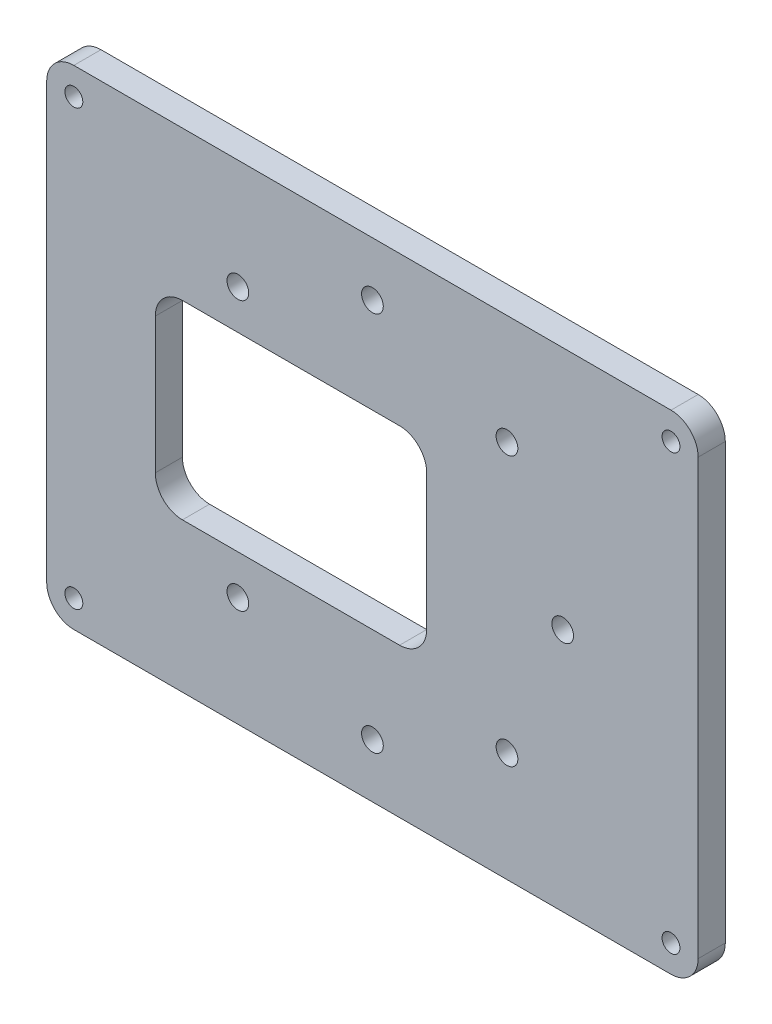
ISO-10303-21;
HEADER;
FILE_DESCRIPTION(('STEP AP214'),'2;1');
FILE_NAME('part.step','',(''),(''),'','','');
FILE_SCHEMA(('AUTOMOTIVE_DESIGN { 1 0 10303 214 1 1 1 1 }'));
ENDSEC;
DATA;
#1=APPLICATION_CONTEXT('core data for automotive mechanical design processes');
#2=APPLICATION_PROTOCOL_DEFINITION('international standard','automotive_design',2000,#1);
#3=PRODUCT_CONTEXT('',#1,'mechanical');
#4=PRODUCT('Part','Part','',(#3));
#5=PRODUCT_RELATED_PRODUCT_CATEGORY('part','',(#4));
#6=PRODUCT_DEFINITION_FORMATION('','',#4);
#7=PRODUCT_DEFINITION_CONTEXT('part definition',#1,'design');
#8=PRODUCT_DEFINITION('design','',#6,#7);
#9=PRODUCT_DEFINITION_SHAPE('','',#8);
#10=(LENGTH_UNIT() NAMED_UNIT(*) SI_UNIT(.MILLI.,.METRE.));
#11=(NAMED_UNIT(*) PLANE_ANGLE_UNIT() SI_UNIT($,.RADIAN.));
#12=(NAMED_UNIT(*) SI_UNIT($,.STERADIAN.) SOLID_ANGLE_UNIT());
#13=UNCERTAINTY_MEASURE_WITH_UNIT(LENGTH_MEASURE(1.E-05),#10,'distance_accuracy_value','');
#14=(GEOMETRIC_REPRESENTATION_CONTEXT(3) GLOBAL_UNCERTAINTY_ASSIGNED_CONTEXT((#13)) GLOBAL_UNIT_ASSIGNED_CONTEXT((#10,
#11,#12)) REPRESENTATION_CONTEXT('',''));
#15=CARTESIAN_POINT('',(0.,0.,0.));
#16=DIRECTION('',(0.,0.,1.));
#17=DIRECTION('',(1.,0.,0.));
#18=AXIS2_PLACEMENT_3D('',#15,#16,#17);
#19=CARTESIAN_POINT('',(0.,0.,5.));
#20=DIRECTION('',(0.,0.,-1.));
#21=DIRECTION('',(-1.,0.,0.));
#22=AXIS2_PLACEMENT_3D('',#19,#20,#21);
#23=PLANE('',#22);
#24=CARTESIAN_POINT('',(-24.95,-45.,5.));
#25=DIRECTION('',(0.,0.,1.));
#26=DIRECTION('',(1.,0.,0.));
#27=AXIS2_PLACEMENT_3D('',#24,#25,#26);
#28=CIRCLE('',#27,2.);
#29=CARTESIAN_POINT('',(-22.95,-45.,5.));
#30=VERTEX_POINT('',#29);
#31=EDGE_CURVE('E318',#30,#30,#28,.T.);
#32=ORIENTED_EDGE('',*,*,#31,.F.);
#33=EDGE_LOOP('',(#32));
#34=FACE_BOUND('',#33,.T.);
#35=CARTESIAN_POINT('',(-115.,-5.,5.));
#36=DIRECTION('',(0.,0.,1.));
#37=DIRECTION('',(1.,0.,0.));
#38=AXIS2_PLACEMENT_3D('',#35,#36,#37);
#39=CIRCLE('',#38,1.65);
#40=CARTESIAN_POINT('',(-113.35,-5.,5.));
#41=VERTEX_POINT('',#40);
#42=EDGE_CURVE('E338',#41,#41,#39,.T.);
#43=ORIENTED_EDGE('',*,*,#42,.F.);
#44=EDGE_LOOP('',(#43));
#45=FACE_BOUND('',#44,.T.);
#46=CARTESIAN_POINT('',(-4.99999999999999,-5.,5.));
#47=DIRECTION('',(0.,0.,1.));
#48=DIRECTION('',(1.,0.,0.));
#49=AXIS2_PLACEMENT_3D('',#46,#47,#48);
#50=CIRCLE('',#49,1.65);
#51=CARTESIAN_POINT('',(-3.34999999999999,-5.,5.));
#52=VERTEX_POINT('',#51);
#53=EDGE_CURVE('E346',#52,#52,#50,.T.);
#54=ORIENTED_EDGE('',*,*,#53,.F.);
#55=EDGE_LOOP('',(#54));
#56=FACE_BOUND('',#55,.T.);
#57=CARTESIAN_POINT('',(-4.99999999999998,-85.,5.));
#58=DIRECTION('',(0.,0.,1.));
#59=DIRECTION('',(1.,0.,0.));
#60=AXIS2_PLACEMENT_3D('',#57,#58,#59);
#61=CIRCLE('',#60,1.65);
#62=CARTESIAN_POINT('',(-3.34999999999998,-85.,5.));
#63=VERTEX_POINT('',#62);
#64=EDGE_CURVE('E354',#63,#63,#61,.T.);
#65=ORIENTED_EDGE('',*,*,#64,.F.);
#66=EDGE_LOOP('',(#65));
#67=FACE_BOUND('',#66,.T.);
#68=CARTESIAN_POINT('',(-115.,-85.,5.));
#69=DIRECTION('',(0.,0.,1.));
#70=DIRECTION('',(1.,0.,0.));
#71=AXIS2_PLACEMENT_3D('',#68,#69,#70);
#72=CIRCLE('',#71,1.65);
#73=CARTESIAN_POINT('',(-113.35,-85.,5.));
#74=VERTEX_POINT('',#73);
#75=EDGE_CURVE('E184',#74,#74,#72,.T.);
#76=ORIENTED_EDGE('',*,*,#75,.F.);
#77=EDGE_LOOP('',(#76));
#78=FACE_BOUND('',#77,.T.);
#79=DIRECTION('',(1.,0.,0.));
#80=VECTOR('',#79,1.);
#81=CARTESIAN_POINT('',(0.,-90.,5.));
#82=LINE('',#81,#80);
#83=CARTESIAN_POINT('',(-115.,-90.,5.));
#84=VERTEX_POINT('',#83);
#85=CARTESIAN_POINT('',(-4.99999999999999,-90.,5.));
#86=VERTEX_POINT('',#85);
#87=EDGE_CURVE('E195',#84,#86,#82,.T.);
#88=ORIENTED_EDGE('',*,*,#87,.T.);
#89=CARTESIAN_POINT('',(-4.99999999999999,-85.,5.));
#90=DIRECTION('',(0.,0.,-1.));
#91=DIRECTION('',(-1.,0.,0.));
#92=AXIS2_PLACEMENT_3D('',#89,#90,#91);
#93=CIRCLE('',#92,5.);
#94=CARTESIAN_POINT('',(0.,-85.,5.));
#95=VERTEX_POINT('',#94);
#96=EDGE_CURVE('E227',#86,#95,#93,.F.);
#97=ORIENTED_EDGE('',*,*,#96,.T.);
#98=DIRECTION('',(0.,1.,0.));
#99=VECTOR('',#98,1.);
#100=CARTESIAN_POINT('',(0.,0.,5.));
#101=LINE('',#100,#99);
#102=CARTESIAN_POINT('',(0.,-5.,5.));
#103=VERTEX_POINT('',#102);
#104=EDGE_CURVE('E174',#95,#103,#101,.T.);
#105=ORIENTED_EDGE('',*,*,#104,.T.);
#106=CARTESIAN_POINT('',(-5.,-5.,5.));
#107=DIRECTION('',(0.,0.,-1.));
#108=DIRECTION('',(-1.,0.,0.));
#109=AXIS2_PLACEMENT_3D('',#106,#107,#108);
#110=CIRCLE('',#109,5.);
#111=CARTESIAN_POINT('',(-5.,0.,5.));
#112=VERTEX_POINT('',#111);
#113=EDGE_CURVE('E218',#103,#112,#110,.F.);
#114=ORIENTED_EDGE('',*,*,#113,.T.);
#115=DIRECTION('',(-1.,0.,0.));
#116=VECTOR('',#115,1.);
#117=CARTESIAN_POINT('',(0.,0.,5.));
#118=LINE('',#117,#116);
#119=CARTESIAN_POINT('',(-115.,0.,5.));
#120=VERTEX_POINT('',#119);
#121=EDGE_CURVE('E366',#112,#120,#118,.T.);
#122=ORIENTED_EDGE('',*,*,#121,.T.);
#123=CARTESIAN_POINT('',(-115.,-5.,5.));
#124=DIRECTION('',(0.,0.,-1.));
#125=DIRECTION('',(-1.,0.,0.));
#126=AXIS2_PLACEMENT_3D('',#123,#124,#125);
#127=CIRCLE('',#126,5.);
#128=CARTESIAN_POINT('',(-120.,-5.,5.));
#129=VERTEX_POINT('',#128);
#130=EDGE_CURVE('E221',#120,#129,#127,.F.);
#131=ORIENTED_EDGE('',*,*,#130,.T.);
#132=DIRECTION('',(0.,-1.,0.));
#133=VECTOR('',#132,1.);
#134=CARTESIAN_POINT('',(-120.,0.,5.));
#135=LINE('',#134,#133);
#136=CARTESIAN_POINT('',(-120.,-85.,5.));
#137=VERTEX_POINT('',#136);
#138=EDGE_CURVE('E369',#129,#137,#135,.T.);
#139=ORIENTED_EDGE('',*,*,#138,.T.);
#140=CARTESIAN_POINT('',(-115.,-85.,5.));
#141=DIRECTION('',(0.,0.,-1.));
#142=DIRECTION('',(-1.,0.,0.));
#143=AXIS2_PLACEMENT_3D('',#140,#141,#142);
#144=CIRCLE('',#143,5.);
#145=EDGE_CURVE('E224',#137,#84,#144,.F.);
#146=ORIENTED_EDGE('',*,*,#145,.T.);
#147=EDGE_LOOP('',(#88,#97,#105,#114,#122,#131,#139,#146));
#148=FACE_BOUND('',#147,.T.);
#149=DIRECTION('',(0.,-1.,0.));
#150=VECTOR('',#149,1.);
#151=CARTESIAN_POINT('',(-100.,-27.5,5.));
#152=LINE('',#151,#150);
#153=CARTESIAN_POINT('',(-100.,-32.5,5.));
#154=VERTEX_POINT('',#153);
#155=CARTESIAN_POINT('',(-100.,-57.5,5.));
#156=VERTEX_POINT('',#155);
#157=EDGE_CURVE('E333',#154,#156,#152,.T.);
#158=ORIENTED_EDGE('',*,*,#157,.F.);
#159=CARTESIAN_POINT('',(-95.,-32.5,5.));
#160=DIRECTION('',(0.,0.,-1.));
#161=DIRECTION('',(-1.,0.,0.));
#162=AXIS2_PLACEMENT_3D('',#159,#160,#161);
#163=CIRCLE('',#162,5.);
#164=CARTESIAN_POINT('',(-95.,-27.5,5.));
#165=VERTEX_POINT('',#164);
#166=EDGE_CURVE('E11',#154,#165,#163,.T.);
#167=ORIENTED_EDGE('',*,*,#166,.T.);
#168=DIRECTION('',(-1.,0.,0.));
#169=VECTOR('',#168,1.);
#170=CARTESIAN_POINT('',(-100.,-27.5,5.));
#171=LINE('',#170,#169);
#172=CARTESIAN_POINT('',(-55.,-27.5,5.));
#173=VERTEX_POINT('',#172);
#174=EDGE_CURVE('E309',#173,#165,#171,.T.);
#175=ORIENTED_EDGE('',*,*,#174,.F.);
#176=CARTESIAN_POINT('',(-55.,-32.5,5.));
#177=DIRECTION('',(0.,0.,-1.));
#178=DIRECTION('',(-1.,0.,0.));
#179=AXIS2_PLACEMENT_3D('',#176,#177,#178);
#180=CIRCLE('',#179,5.);
#181=CARTESIAN_POINT('',(-50.,-32.5,5.));
#182=VERTEX_POINT('',#181);
#183=EDGE_CURVE('E286',#173,#182,#180,.T.);
#184=ORIENTED_EDGE('',*,*,#183,.T.);
#185=DIRECTION('',(0.,1.,0.));
#186=VECTOR('',#185,1.);
#187=CARTESIAN_POINT('',(-50.,-27.5,5.));
#188=LINE('',#187,#186);
#189=CARTESIAN_POINT('',(-50.,-57.5,5.));
#190=VERTEX_POINT('',#189);
#191=EDGE_CURVE('E313',#190,#182,#188,.T.);
#192=ORIENTED_EDGE('',*,*,#191,.F.);
#193=CARTESIAN_POINT('',(-55.,-57.5,5.));
#194=DIRECTION('',(0.,0.,-1.));
#195=DIRECTION('',(-1.,0.,0.));
#196=AXIS2_PLACEMENT_3D('',#193,#194,#195);
#197=CIRCLE('',#196,5.);
#198=CARTESIAN_POINT('',(-55.,-62.5,5.));
#199=VERTEX_POINT('',#198);
#200=EDGE_CURVE('E280',#190,#199,#197,.T.);
#201=ORIENTED_EDGE('',*,*,#200,.T.);
#202=DIRECTION('',(1.,0.,0.));
#203=VECTOR('',#202,1.);
#204=CARTESIAN_POINT('',(-100.,-62.5,5.));
#205=LINE('',#204,#203);
#206=CARTESIAN_POINT('',(-95.,-62.5,5.));
#207=VERTEX_POINT('',#206);
#208=EDGE_CURVE('E321',#207,#199,#205,.T.);
#209=ORIENTED_EDGE('',*,*,#208,.F.);
#210=CARTESIAN_POINT('',(-95.,-57.5,5.));
#211=DIRECTION('',(0.,0.,-1.));
#212=DIRECTION('',(-1.,0.,0.));
#213=AXIS2_PLACEMENT_3D('',#210,#211,#212);
#214=CIRCLE('',#213,5.);
#215=EDGE_CURVE('E274',#207,#156,#214,.T.);
#216=ORIENTED_EDGE('',*,*,#215,.T.);
#217=EDGE_LOOP('',(#158,#167,#175,#184,#192,#201,#209,#216));
#218=FACE_BOUND('',#217,.T.);
#219=CARTESIAN_POINT('',(-35.2159073194115,-69.7840926805885,5.));
#220=DIRECTION('',(0.,0.,1.));
#221=DIRECTION('',(1.,0.,0.));
#222=AXIS2_PLACEMENT_3D('',#219,#220,#221);
#223=CIRCLE('',#222,2.00000000000001);
#224=CARTESIAN_POINT('',(-33.2159073194115,-69.7840926805885,5.));
#225=VERTEX_POINT('',#224);
#226=EDGE_CURVE('E306',#225,#225,#223,.T.);
#227=ORIENTED_EDGE('',*,*,#226,.F.);
#228=EDGE_LOOP('',(#227));
#229=FACE_BOUND('',#228,.T.);
#230=CARTESIAN_POINT('',(-60.0000000000001,-80.05,5.));
#231=DIRECTION('',(0.,0.,1.));
#232=DIRECTION('',(1.,0.,0.));
#233=AXIS2_PLACEMENT_3D('',#230,#231,#232);
#234=CIRCLE('',#233,1.99999999999999);
#235=CARTESIAN_POINT('',(-58.0000000000001,-80.05,5.));
#236=VERTEX_POINT('',#235);
#237=EDGE_CURVE('E557',#236,#236,#234,.T.);
#238=ORIENTED_EDGE('',*,*,#237,.F.);
#239=EDGE_LOOP('',(#238));
#240=FACE_BOUND('',#239,.T.);
#241=CARTESIAN_POINT('',(-84.7840926805886,-69.7840926805884,5.));
#242=DIRECTION('',(0.,0.,1.));
#243=DIRECTION('',(1.,0.,0.));
#244=AXIS2_PLACEMENT_3D('',#241,#242,#243);
#245=CIRCLE('',#244,2.00000000000001);
#246=CARTESIAN_POINT('',(-82.7840926805886,-69.7840926805884,5.));
#247=VERTEX_POINT('',#246);
#248=EDGE_CURVE('E565',#247,#247,#245,.T.);
#249=ORIENTED_EDGE('',*,*,#248,.F.);
#250=EDGE_LOOP('',(#249));
#251=FACE_BOUND('',#250,.T.);
#252=CARTESIAN_POINT('',(-84.7840926805882,-20.2159073194113,5.));
#253=DIRECTION('',(0.,0.,1.));
#254=DIRECTION('',(1.,0.,0.));
#255=AXIS2_PLACEMENT_3D('',#252,#253,#254);
#256=CIRCLE('',#255,2.00000000000001);
#257=CARTESIAN_POINT('',(-82.7840926805882,-20.2159073194113,5.));
#258=VERTEX_POINT('',#257);
#259=EDGE_CURVE('E573',#258,#258,#256,.T.);
#260=ORIENTED_EDGE('',*,*,#259,.F.);
#261=EDGE_LOOP('',(#260));
#262=FACE_BOUND('',#261,.T.);
#263=CARTESIAN_POINT('',(-59.9999999999996,-9.95,5.));
#264=DIRECTION('',(0.,0.,1.));
#265=DIRECTION('',(1.,0.,0.));
#266=AXIS2_PLACEMENT_3D('',#263,#264,#265);
#267=CIRCLE('',#266,2.);
#268=CARTESIAN_POINT('',(-57.9999999999996,-9.95,5.));
#269=VERTEX_POINT('',#268);
#270=EDGE_CURVE('E581',#269,#269,#267,.T.);
#271=ORIENTED_EDGE('',*,*,#270,.F.);
#272=EDGE_LOOP('',(#271));
#273=FACE_BOUND('',#272,.T.);
#274=CARTESIAN_POINT('',(-35.2159073194112,-20.2159073194118,5.));
#275=DIRECTION('',(0.,0.,1.));
#276=DIRECTION('',(1.,0.,0.));
#277=AXIS2_PLACEMENT_3D('',#274,#275,#276);
#278=CIRCLE('',#277,2.00000000000001);
#279=CARTESIAN_POINT('',(-33.2159073194112,-20.2159073194118,5.));
#280=VERTEX_POINT('',#279);
#281=EDGE_CURVE('E589',#280,#280,#278,.T.);
#282=ORIENTED_EDGE('',*,*,#281,.F.);
#283=EDGE_LOOP('',(#282));
#284=FACE_BOUND('',#283,.T.);
#285=ADVANCED_FACE('F39',(#34,#45,#56,#67,#78,#148,#218,#229,#240,#251,#262,#273,#284),#23,.F.);
#286=CARTESIAN_POINT('',(0.,0.,0.));
#287=DIRECTION('',(0.,0.,-1.));
#288=DIRECTION('',(-1.,0.,0.));
#289=AXIS2_PLACEMENT_3D('',#286,#287,#288);
#290=PLANE('',#289);
#291=CARTESIAN_POINT('',(-59.9999999999996,-9.95,0.));
#292=DIRECTION('',(0.,0.,1.));
#293=DIRECTION('',(1.,0.,0.));
#294=AXIS2_PLACEMENT_3D('',#291,#292,#293);
#295=CIRCLE('',#294,2.);
#296=CARTESIAN_POINT('',(-57.9999999999996,-9.95,0.));
#297=VERTEX_POINT('',#296);
#298=EDGE_CURVE('E585',#297,#297,#295,.T.);
#299=ORIENTED_EDGE('',*,*,#298,.T.);
#300=EDGE_LOOP('',(#299));
#301=FACE_BOUND('',#300,.T.);
#302=CARTESIAN_POINT('',(-84.7840926805886,-69.7840926805884,0.));
#303=DIRECTION('',(0.,0.,1.));
#304=DIRECTION('',(1.,0.,0.));
#305=AXIS2_PLACEMENT_3D('',#302,#303,#304);
#306=CIRCLE('',#305,2.00000000000001);
#307=CARTESIAN_POINT('',(-82.7840926805886,-69.7840926805884,0.));
#308=VERTEX_POINT('',#307);
#309=EDGE_CURVE('E569',#308,#308,#306,.T.);
#310=ORIENTED_EDGE('',*,*,#309,.T.);
#311=EDGE_LOOP('',(#310));
#312=FACE_BOUND('',#311,.T.);
#313=CARTESIAN_POINT('',(-35.2159073194115,-69.7840926805885,0.));
#314=DIRECTION('',(0.,0.,1.));
#315=DIRECTION('',(1.,0.,0.));
#316=AXIS2_PLACEMENT_3D('',#313,#314,#315);
#317=CIRCLE('',#316,2.00000000000001);
#318=CARTESIAN_POINT('',(-33.2159073194115,-69.7840926805885,0.));
#319=VERTEX_POINT('',#318);
#320=EDGE_CURVE('E553',#319,#319,#317,.T.);
#321=ORIENTED_EDGE('',*,*,#320,.T.);
#322=EDGE_LOOP('',(#321));
#323=FACE_BOUND('',#322,.T.);
#324=CARTESIAN_POINT('',(-115.,-5.,0.));
#325=DIRECTION('',(0.,0.,1.));
#326=DIRECTION('',(1.,0.,0.));
#327=AXIS2_PLACEMENT_3D('',#324,#325,#326);
#328=CIRCLE('',#327,1.65);
#329=CARTESIAN_POINT('',(-113.35,-5.,0.));
#330=VERTEX_POINT('',#329);
#331=EDGE_CURVE('E336',#330,#330,#328,.T.);
#332=ORIENTED_EDGE('',*,*,#331,.T.);
#333=EDGE_LOOP('',(#332));
#334=FACE_BOUND('',#333,.T.);
#335=CARTESIAN_POINT('',(-4.99999999999998,-85.,0.));
#336=DIRECTION('',(0.,0.,1.));
#337=DIRECTION('',(1.,0.,0.));
#338=AXIS2_PLACEMENT_3D('',#335,#336,#337);
#339=CIRCLE('',#338,1.65);
#340=CARTESIAN_POINT('',(-3.34999999999998,-85.,0.));
#341=VERTEX_POINT('',#340);
#342=EDGE_CURVE('E350',#341,#341,#339,.T.);
#343=ORIENTED_EDGE('',*,*,#342,.T.);
#344=EDGE_LOOP('',(#343));
#345=FACE_BOUND('',#344,.T.);
#346=DIRECTION('',(0.,1.,0.));
#347=VECTOR('',#346,1.);
#348=CARTESIAN_POINT('',(0.,0.,0.));
#349=LINE('',#348,#347);
#350=CARTESIAN_POINT('',(0.,-85.,0.));
#351=VERTEX_POINT('',#350);
#352=CARTESIAN_POINT('',(0.,-5.,0.));
#353=VERTEX_POINT('',#352);
#354=EDGE_CURVE('E171',#351,#353,#349,.T.);
#355=ORIENTED_EDGE('',*,*,#354,.F.);
#356=CARTESIAN_POINT('',(-4.99999999999999,-85.,0.));
#357=DIRECTION('',(0.,0.,-1.));
#358=DIRECTION('',(-1.,0.,0.));
#359=AXIS2_PLACEMENT_3D('',#356,#357,#358);
#360=CIRCLE('',#359,5.);
#361=CARTESIAN_POINT('',(-4.99999999999999,-90.,0.));
#362=VERTEX_POINT('',#361);
#363=EDGE_CURVE('E153',#351,#362,#360,.T.);
#364=ORIENTED_EDGE('',*,*,#363,.T.);
#365=DIRECTION('',(1.,0.,0.));
#366=VECTOR('',#365,1.);
#367=CARTESIAN_POINT('',(0.,-90.,0.));
#368=LINE('',#367,#366);
#369=CARTESIAN_POINT('',(-115.,-90.,0.));
#370=VERTEX_POINT('',#369);
#371=EDGE_CURVE('E201',#370,#362,#368,.T.);
#372=ORIENTED_EDGE('',*,*,#371,.F.);
#373=CARTESIAN_POINT('',(-115.,-85.,0.));
#374=DIRECTION('',(0.,0.,-1.));
#375=DIRECTION('',(-1.,0.,0.));
#376=AXIS2_PLACEMENT_3D('',#373,#374,#375);
#377=CIRCLE('',#376,5.);
#378=CARTESIAN_POINT('',(-120.,-85.,0.));
#379=VERTEX_POINT('',#378);
#380=EDGE_CURVE('E165',#370,#379,#377,.T.);
#381=ORIENTED_EDGE('',*,*,#380,.T.);
#382=DIRECTION('',(0.,-1.,0.));
#383=VECTOR('',#382,1.);
#384=CARTESIAN_POINT('',(-120.,0.,0.));
#385=LINE('',#384,#383);
#386=CARTESIAN_POINT('',(-120.,-5.,0.));
#387=VERTEX_POINT('',#386);
#388=EDGE_CURVE('E189',#387,#379,#385,.T.);
#389=ORIENTED_EDGE('',*,*,#388,.F.);
#390=CARTESIAN_POINT('',(-115.,-5.,0.));
#391=DIRECTION('',(0.,0.,-1.));
#392=DIRECTION('',(-1.,0.,0.));
#393=AXIS2_PLACEMENT_3D('',#390,#391,#392);
#394=CIRCLE('',#393,5.);
#395=CARTESIAN_POINT('',(-115.,0.,0.));
#396=VERTEX_POINT('',#395);
#397=EDGE_CURVE('E208',#387,#396,#394,.T.);
#398=ORIENTED_EDGE('',*,*,#397,.T.);
#399=DIRECTION('',(-1.,0.,0.));
#400=VECTOR('',#399,1.);
#401=CARTESIAN_POINT('',(0.,0.,0.));
#402=LINE('',#401,#400);
#403=CARTESIAN_POINT('',(-5.,0.,0.));
#404=VERTEX_POINT('',#403);
#405=EDGE_CURVE('E183',#404,#396,#402,.T.);
#406=ORIENTED_EDGE('',*,*,#405,.F.);
#407=CARTESIAN_POINT('',(-5.,-5.,0.));
#408=DIRECTION('',(0.,0.,-1.));
#409=DIRECTION('',(-1.,0.,0.));
#410=AXIS2_PLACEMENT_3D('',#407,#408,#409);
#411=CIRCLE('',#410,5.);
#412=EDGE_CURVE('E176',#404,#353,#411,.T.);
#413=ORIENTED_EDGE('',*,*,#412,.T.);
#414=EDGE_LOOP('',(#355,#364,#372,#381,#389,#398,#406,#413));
#415=FACE_BOUND('',#414,.T.);
#416=CARTESIAN_POINT('',(-115.,-85.,0.));
#417=DIRECTION('',(0.,0.,1.));
#418=DIRECTION('',(1.,0.,0.));
#419=AXIS2_PLACEMENT_3D('',#416,#417,#418);
#420=CIRCLE('',#419,1.65);
#421=CARTESIAN_POINT('',(-113.35,-85.,0.));
#422=VERTEX_POINT('',#421);
#423=EDGE_CURVE('E192',#422,#422,#420,.T.);
#424=ORIENTED_EDGE('',*,*,#423,.T.);
#425=EDGE_LOOP('',(#424));
#426=FACE_BOUND('',#425,.T.);
#427=CARTESIAN_POINT('',(-4.99999999999999,-5.,0.));
#428=DIRECTION('',(0.,0.,1.));
#429=DIRECTION('',(1.,0.,0.));
#430=AXIS2_PLACEMENT_3D('',#427,#428,#429);
#431=CIRCLE('',#430,1.65);
#432=CARTESIAN_POINT('',(-3.34999999999999,-5.,0.));
#433=VERTEX_POINT('',#432);
#434=EDGE_CURVE('E342',#433,#433,#431,.T.);
#435=ORIENTED_EDGE('',*,*,#434,.T.);
#436=EDGE_LOOP('',(#435));
#437=FACE_BOUND('',#436,.T.);
#438=CARTESIAN_POINT('',(-24.95,-45.,0.));
#439=DIRECTION('',(0.,0.,1.));
#440=DIRECTION('',(1.,0.,0.));
#441=AXIS2_PLACEMENT_3D('',#438,#439,#440);
#442=CIRCLE('',#441,2.);
#443=CARTESIAN_POINT('',(-22.95,-45.,0.));
#444=VERTEX_POINT('',#443);
#445=EDGE_CURVE('E312',#444,#444,#442,.T.);
#446=ORIENTED_EDGE('',*,*,#445,.T.);
#447=EDGE_LOOP('',(#446));
#448=FACE_BOUND('',#447,.T.);
#449=DIRECTION('',(0.,1.,0.));
#450=VECTOR('',#449,1.);
#451=CARTESIAN_POINT('',(-50.,-27.5,0.));
#452=LINE('',#451,#450);
#453=CARTESIAN_POINT('',(-50.,-57.5,0.));
#454=VERTEX_POINT('',#453);
#455=CARTESIAN_POINT('',(-50.,-32.5,0.));
#456=VERTEX_POINT('',#455);
#457=EDGE_CURVE('E328',#454,#456,#452,.T.);
#458=ORIENTED_EDGE('',*,*,#457,.T.);
#459=CARTESIAN_POINT('',(-55.,-32.5,0.));
#460=DIRECTION('',(0.,0.,-1.));
#461=DIRECTION('',(-1.,0.,0.));
#462=AXIS2_PLACEMENT_3D('',#459,#460,#461);
#463=CIRCLE('',#462,5.);
#464=CARTESIAN_POINT('',(-55.,-27.5,0.));
#465=VERTEX_POINT('',#464);
#466=EDGE_CURVE('E283',#456,#465,#463,.F.);
#467=ORIENTED_EDGE('',*,*,#466,.T.);
#468=DIRECTION('',(-1.,0.,0.));
#469=VECTOR('',#468,1.);
#470=CARTESIAN_POINT('',(-100.,-27.5,0.));
#471=LINE('',#470,#469);
#472=CARTESIAN_POINT('',(-95.,-27.5,0.));
#473=VERTEX_POINT('',#472);
#474=EDGE_CURVE('E296',#465,#473,#471,.T.);
#475=ORIENTED_EDGE('',*,*,#474,.T.);
#476=CARTESIAN_POINT('',(-95.,-32.5,0.));
#477=DIRECTION('',(0.,0.,-1.));
#478=DIRECTION('',(-1.,0.,0.));
#479=AXIS2_PLACEMENT_3D('',#476,#477,#478);
#480=CIRCLE('',#479,5.);
#481=CARTESIAN_POINT('',(-100.,-32.5,0.));
#482=VERTEX_POINT('',#481);
#483=EDGE_CURVE('E48',#473,#482,#480,.F.);
#484=ORIENTED_EDGE('',*,*,#483,.T.);
#485=DIRECTION('',(0.,-1.,0.));
#486=VECTOR('',#485,1.);
#487=CARTESIAN_POINT('',(-100.,-27.5,0.));
#488=LINE('',#487,#486);
#489=CARTESIAN_POINT('',(-100.,-57.5,0.));
#490=VERTEX_POINT('',#489);
#491=EDGE_CURVE('E295',#482,#490,#488,.T.);
#492=ORIENTED_EDGE('',*,*,#491,.T.);
#493=CARTESIAN_POINT('',(-95.,-57.5,0.));
#494=DIRECTION('',(0.,0.,-1.));
#495=DIRECTION('',(-1.,0.,0.));
#496=AXIS2_PLACEMENT_3D('',#493,#494,#495);
#497=CIRCLE('',#496,5.);
#498=CARTESIAN_POINT('',(-95.,-62.5,0.));
#499=VERTEX_POINT('',#498);
#500=EDGE_CURVE('E271',#490,#499,#497,.F.);
#501=ORIENTED_EDGE('',*,*,#500,.T.);
#502=DIRECTION('',(1.,0.,0.));
#503=VECTOR('',#502,1.);
#504=CARTESIAN_POINT('',(-100.,-62.5,0.));
#505=LINE('',#504,#503);
#506=CARTESIAN_POINT('',(-55.,-62.5,0.));
#507=VERTEX_POINT('',#506);
#508=EDGE_CURVE('E305',#499,#507,#505,.T.);
#509=ORIENTED_EDGE('',*,*,#508,.T.);
#510=CARTESIAN_POINT('',(-55.,-57.5,0.));
#511=DIRECTION('',(0.,0.,-1.));
#512=DIRECTION('',(-1.,0.,0.));
#513=AXIS2_PLACEMENT_3D('',#510,#511,#512);
#514=CIRCLE('',#513,5.);
#515=EDGE_CURVE('E277',#507,#454,#514,.F.);
#516=ORIENTED_EDGE('',*,*,#515,.T.);
#517=EDGE_LOOP('',(#458,#467,#475,#484,#492,#501,#509,#516));
#518=FACE_BOUND('',#517,.T.);
#519=CARTESIAN_POINT('',(-60.0000000000001,-80.05,0.));
#520=DIRECTION('',(0.,0.,1.));
#521=DIRECTION('',(1.,0.,0.));
#522=AXIS2_PLACEMENT_3D('',#519,#520,#521);
#523=CIRCLE('',#522,1.99999999999999);
#524=CARTESIAN_POINT('',(-58.0000000000001,-80.05,0.));
#525=VERTEX_POINT('',#524);
#526=EDGE_CURVE('E561',#525,#525,#523,.T.);
#527=ORIENTED_EDGE('',*,*,#526,.T.);
#528=EDGE_LOOP('',(#527));
#529=FACE_BOUND('',#528,.T.);
#530=CARTESIAN_POINT('',(-84.7840926805882,-20.2159073194113,0.));
#531=DIRECTION('',(0.,0.,1.));
#532=DIRECTION('',(1.,0.,0.));
#533=AXIS2_PLACEMENT_3D('',#530,#531,#532);
#534=CIRCLE('',#533,2.00000000000001);
#535=CARTESIAN_POINT('',(-82.7840926805882,-20.2159073194113,0.));
#536=VERTEX_POINT('',#535);
#537=EDGE_CURVE('E577',#536,#536,#534,.T.);
#538=ORIENTED_EDGE('',*,*,#537,.T.);
#539=EDGE_LOOP('',(#538));
#540=FACE_BOUND('',#539,.T.);
#541=CARTESIAN_POINT('',(-35.2159073194112,-20.2159073194118,0.));
#542=DIRECTION('',(0.,0.,1.));
#543=DIRECTION('',(1.,0.,0.));
#544=AXIS2_PLACEMENT_3D('',#541,#542,#543);
#545=CIRCLE('',#544,2.00000000000001);
#546=CARTESIAN_POINT('',(-33.2159073194112,-20.2159073194118,0.));
#547=VERTEX_POINT('',#546);
#548=EDGE_CURVE('E593',#547,#547,#545,.T.);
#549=ORIENTED_EDGE('',*,*,#548,.T.);
#550=EDGE_LOOP('',(#549));
#551=FACE_BOUND('',#550,.T.);
#552=ADVANCED_FACE('F179',(#301,#312,#323,#334,#345,#415,#426,#437,#448,#518,#529,#540,#551),
#290,.T.);
#553=CARTESIAN_POINT('',(0.,0.,5.));
#554=DIRECTION('',(-1.,0.,0.));
#555=DIRECTION('',(0.,-1.,0.));
#556=AXIS2_PLACEMENT_3D('',#553,#554,#555);
#557=PLANE('',#556);
#558=ORIENTED_EDGE('',*,*,#104,.F.);
#559=DIRECTION('',(0.,0.,-1.));
#560=VECTOR('',#559,1.);
#561=CARTESIAN_POINT('',(0.,-85.,5.));
#562=LINE('',#561,#560);
#563=EDGE_CURVE('E157',#95,#351,#562,.T.);
#564=ORIENTED_EDGE('',*,*,#563,.T.);
#565=ORIENTED_EDGE('',*,*,#354,.T.);
#566=DIRECTION('',(0.,0.,-1.));
#567=VECTOR('',#566,1.);
#568=CARTESIAN_POINT('',(0.,-5.,5.));
#569=LINE('',#568,#567);
#570=EDGE_CURVE('E177',#353,#103,#569,.F.);
#571=ORIENTED_EDGE('',*,*,#570,.T.);
#572=EDGE_LOOP('',(#558,#564,#565,#571));
#573=FACE_BOUND('',#572,.T.);
#574=ADVANCED_FACE('F170',(#573),#557,.F.);
#575=CARTESIAN_POINT('',(0.,0.,5.));
#576=DIRECTION('',(0.,-1.,0.));
#577=DIRECTION('',(0.,0.,-1.));
#578=AXIS2_PLACEMENT_3D('',#575,#576,#577);
#579=PLANE('',#578);
#580=ORIENTED_EDGE('',*,*,#405,.T.);
#581=DIRECTION('',(0.,0.,-1.));
#582=VECTOR('',#581,1.);
#583=CARTESIAN_POINT('',(-115.,0.,5.));
#584=LINE('',#583,#582);
#585=EDGE_CURVE('E241',#396,#120,#584,.F.);
#586=ORIENTED_EDGE('',*,*,#585,.T.);
#587=ORIENTED_EDGE('',*,*,#121,.F.);
#588=DIRECTION('',(0.,0.,-1.));
#589=VECTOR('',#588,1.);
#590=CARTESIAN_POINT('',(-5.,0.,5.));
#591=LINE('',#590,#589);
#592=EDGE_CURVE('E237',#112,#404,#591,.T.);
#593=ORIENTED_EDGE('',*,*,#592,.T.);
#594=EDGE_LOOP('',(#580,#586,#587,#593));
#595=FACE_BOUND('',#594,.T.);
#596=ADVANCED_FACE('F393',(#595),#579,.F.);
#597=CARTESIAN_POINT('',(-120.,0.,5.));
#598=DIRECTION('',(1.,0.,0.));
#599=DIRECTION('',(0.,1.,0.));
#600=AXIS2_PLACEMENT_3D('',#597,#598,#599);
#601=PLANE('',#600);
#602=ORIENTED_EDGE('',*,*,#388,.T.);
#603=DIRECTION('',(0.,0.,-1.));
#604=VECTOR('',#603,1.);
#605=CARTESIAN_POINT('',(-120.,-85.,5.));
#606=LINE('',#605,#604);
#607=EDGE_CURVE('E234',#379,#137,#606,.F.);
#608=ORIENTED_EDGE('',*,*,#607,.T.);
#609=ORIENTED_EDGE('',*,*,#138,.F.);
#610=DIRECTION('',(0.,0.,-1.));
#611=VECTOR('',#610,1.);
#612=CARTESIAN_POINT('',(-120.,-5.,5.));
#613=LINE('',#612,#611);
#614=EDGE_CURVE('E230',#129,#387,#613,.T.);
#615=ORIENTED_EDGE('',*,*,#614,.T.);
#616=EDGE_LOOP('',(#602,#608,#609,#615));
#617=FACE_BOUND('',#616,.T.);
#618=ADVANCED_FACE('F386',(#617),#601,.F.);
#619=CARTESIAN_POINT('',(0.,-90.,5.));
#620=DIRECTION('',(0.,1.,0.));
#621=DIRECTION('',(-1.,0.,0.));
#622=AXIS2_PLACEMENT_3D('',#619,#620,#621);
#623=PLANE('',#622);
#624=ORIENTED_EDGE('',*,*,#371,.T.);
#625=DIRECTION('',(0.,0.,-1.));
#626=VECTOR('',#625,1.);
#627=CARTESIAN_POINT('',(-4.99999999999999,-90.,5.));
#628=LINE('',#627,#626);
#629=EDGE_CURVE('E158',#362,#86,#628,.F.);
#630=ORIENTED_EDGE('',*,*,#629,.T.);
#631=ORIENTED_EDGE('',*,*,#87,.F.);
#632=DIRECTION('',(0.,0.,-1.));
#633=VECTOR('',#632,1.);
#634=CARTESIAN_POINT('',(-115.,-90.,5.));
#635=LINE('',#634,#633);
#636=EDGE_CURVE('E164',#84,#370,#635,.T.);
#637=ORIENTED_EDGE('',*,*,#636,.T.);
#638=EDGE_LOOP('',(#624,#630,#631,#637));
#639=FACE_BOUND('',#638,.T.);
#640=ADVANCED_FACE('F380',(#639),#623,.F.);
#641=CARTESIAN_POINT('',(-115.,-85.,5.));
#642=DIRECTION('',(0.,0.,-1.));
#643=DIRECTION('',(-1.,0.,0.));
#644=AXIS2_PLACEMENT_3D('',#641,#642,#643);
#645=CYLINDRICAL_SURFACE('',#644,1.65);
#646=ORIENTED_EDGE('',*,*,#75,.T.);
#647=EDGE_LOOP('',(#646));
#648=FACE_BOUND('',#647,.T.);
#649=ORIENTED_EDGE('',*,*,#423,.F.);
#650=EDGE_LOOP('',(#649));
#651=FACE_BOUND('',#650,.T.);
#652=ADVANCED_FACE('F421',(#648,#651),#645,.F.);
#653=CARTESIAN_POINT('',(-4.99999999999998,-85.,5.));
#654=DIRECTION('',(0.,0.,-1.));
#655=DIRECTION('',(-1.,0.,0.));
#656=AXIS2_PLACEMENT_3D('',#653,#654,#655);
#657=CYLINDRICAL_SURFACE('',#656,1.65);
#658=ORIENTED_EDGE('',*,*,#64,.T.);
#659=EDGE_LOOP('',(#658));
#660=FACE_BOUND('',#659,.T.);
#661=ORIENTED_EDGE('',*,*,#342,.F.);
#662=EDGE_LOOP('',(#661));
#663=FACE_BOUND('',#662,.T.);
#664=ADVANCED_FACE('F635',(#660,#663),#657,.F.);
#665=CARTESIAN_POINT('',(-4.99999999999999,-5.,5.));
#666=DIRECTION('',(0.,0.,-1.));
#667=DIRECTION('',(-1.,0.,0.));
#668=AXIS2_PLACEMENT_3D('',#665,#666,#667);
#669=CYLINDRICAL_SURFACE('',#668,1.65);
#670=ORIENTED_EDGE('',*,*,#53,.T.);
#671=EDGE_LOOP('',(#670));
#672=FACE_BOUND('',#671,.T.);
#673=ORIENTED_EDGE('',*,*,#434,.F.);
#674=EDGE_LOOP('',(#673));
#675=FACE_BOUND('',#674,.T.);
#676=ADVANCED_FACE('F632',(#672,#675),#669,.F.);
#677=CARTESIAN_POINT('',(-115.,-5.,5.));
#678=DIRECTION('',(0.,0.,-1.));
#679=DIRECTION('',(-1.,0.,0.));
#680=AXIS2_PLACEMENT_3D('',#677,#678,#679);
#681=CYLINDRICAL_SURFACE('',#680,1.65);
#682=ORIENTED_EDGE('',*,*,#42,.T.);
#683=EDGE_LOOP('',(#682));
#684=FACE_BOUND('',#683,.T.);
#685=ORIENTED_EDGE('',*,*,#331,.F.);
#686=EDGE_LOOP('',(#685));
#687=FACE_BOUND('',#686,.T.);
#688=ADVANCED_FACE('F628',(#684,#687),#681,.F.);
#689=CARTESIAN_POINT('',(-24.95,-45.,5.));
#690=DIRECTION('',(0.,0.,-1.));
#691=DIRECTION('',(-1.,0.,0.));
#692=AXIS2_PLACEMENT_3D('',#689,#690,#691);
#693=CYLINDRICAL_SURFACE('',#692,2.);
#694=ORIENTED_EDGE('',*,*,#31,.T.);
#695=EDGE_LOOP('',(#694));
#696=FACE_BOUND('',#695,.T.);
#697=ORIENTED_EDGE('',*,*,#445,.F.);
#698=EDGE_LOOP('',(#697));
#699=FACE_BOUND('',#698,.T.);
#700=ADVANCED_FACE('F471',(#696,#699),#693,.F.);
#701=CARTESIAN_POINT('',(-100.,-27.5,5.));
#702=DIRECTION('',(1.,0.,0.));
#703=DIRECTION('',(0.,0.,-1.));
#704=AXIS2_PLACEMENT_3D('',#701,#702,#703);
#705=PLANE('',#704);
#706=ORIENTED_EDGE('',*,*,#157,.T.);
#707=DIRECTION('',(0.,0.,-1.));
#708=VECTOR('',#707,1.);
#709=CARTESIAN_POINT('',(-100.,-57.5,0.));
#710=LINE('',#709,#708);
#711=EDGE_CURVE('E247',#156,#490,#710,.T.);
#712=ORIENTED_EDGE('',*,*,#711,.T.);
#713=ORIENTED_EDGE('',*,*,#491,.F.);
#714=DIRECTION('',(0.,0.,-1.));
#715=VECTOR('',#714,1.);
#716=CARTESIAN_POINT('',(-100.,-32.5,5.));
#717=LINE('',#716,#715);
#718=EDGE_CURVE('E244',#482,#154,#717,.F.);
#719=ORIENTED_EDGE('',*,*,#718,.T.);
#720=EDGE_LOOP('',(#706,#712,#713,#719));
#721=FACE_BOUND('',#720,.T.);
#722=ADVANCED_FACE('F302',(#721),#705,.T.);
#723=CARTESIAN_POINT('',(-100.,-62.5,5.));
#724=DIRECTION('',(0.,1.,0.));
#725=DIRECTION('',(0.,0.,1.));
#726=AXIS2_PLACEMENT_3D('',#723,#724,#725);
#727=PLANE('',#726);
#728=ORIENTED_EDGE('',*,*,#508,.F.);
#729=DIRECTION('',(0.,0.,-1.));
#730=VECTOR('',#729,1.);
#731=CARTESIAN_POINT('',(-95.,-62.5,5.));
#732=LINE('',#731,#730);
#733=EDGE_CURVE('E255',#499,#207,#732,.F.);
#734=ORIENTED_EDGE('',*,*,#733,.T.);
#735=ORIENTED_EDGE('',*,*,#208,.T.);
#736=DIRECTION('',(0.,0.,-1.));
#737=VECTOR('',#736,1.);
#738=CARTESIAN_POINT('',(-55.,-62.5,0.));
#739=LINE('',#738,#737);
#740=EDGE_CURVE('E251',#199,#507,#739,.T.);
#741=ORIENTED_EDGE('',*,*,#740,.T.);
#742=EDGE_LOOP('',(#728,#734,#735,#741));
#743=FACE_BOUND('',#742,.T.);
#744=ADVANCED_FACE('F470',(#743),#727,.T.);
#745=CARTESIAN_POINT('',(-50.,-27.5,5.));
#746=DIRECTION('',(-1.,0.,0.));
#747=DIRECTION('',(0.,-1.,0.));
#748=AXIS2_PLACEMENT_3D('',#745,#746,#747);
#749=PLANE('',#748);
#750=ORIENTED_EDGE('',*,*,#457,.F.);
#751=DIRECTION('',(0.,0.,-1.));
#752=VECTOR('',#751,1.);
#753=CARTESIAN_POINT('',(-50.,-57.5,5.));
#754=LINE('',#753,#752);
#755=EDGE_CURVE('E262',#454,#190,#754,.F.);
#756=ORIENTED_EDGE('',*,*,#755,.T.);
#757=ORIENTED_EDGE('',*,*,#191,.T.);
#758=DIRECTION('',(0.,0.,-1.));
#759=VECTOR('',#758,1.);
#760=CARTESIAN_POINT('',(-50.,-32.5,0.));
#761=LINE('',#760,#759);
#762=EDGE_CURVE('E258',#182,#456,#761,.T.);
#763=ORIENTED_EDGE('',*,*,#762,.T.);
#764=EDGE_LOOP('',(#750,#756,#757,#763));
#765=FACE_BOUND('',#764,.T.);
#766=ADVANCED_FACE('F482',(#765),#749,.T.);
#767=CARTESIAN_POINT('',(-100.,-27.5,5.));
#768=DIRECTION('',(0.,-1.,0.));
#769=DIRECTION('',(1.,0.,0.));
#770=AXIS2_PLACEMENT_3D('',#767,#768,#769);
#771=PLANE('',#770);
#772=ORIENTED_EDGE('',*,*,#474,.F.);
#773=DIRECTION('',(0.,0.,-1.));
#774=VECTOR('',#773,1.);
#775=CARTESIAN_POINT('',(-55.,-27.5,5.));
#776=LINE('',#775,#774);
#777=EDGE_CURVE('E60',#465,#173,#776,.F.);
#778=ORIENTED_EDGE('',*,*,#777,.T.);
#779=ORIENTED_EDGE('',*,*,#174,.T.);
#780=DIRECTION('',(0.,0.,-1.));
#781=VECTOR('',#780,1.);
#782=CARTESIAN_POINT('',(-95.,-27.5,0.));
#783=LINE('',#782,#781);
#784=EDGE_CURVE('E265',#165,#473,#783,.T.);
#785=ORIENTED_EDGE('',*,*,#784,.T.);
#786=EDGE_LOOP('',(#772,#778,#779,#785));
#787=FACE_BOUND('',#786,.T.);
#788=ADVANCED_FACE('F308',(#787),#771,.T.);
#789=CARTESIAN_POINT('',(-35.2159073194115,-69.7840926805885,5.));
#790=DIRECTION('',(0.,0.,-1.));
#791=DIRECTION('',(-1.,0.,0.));
#792=AXIS2_PLACEMENT_3D('',#789,#790,#791);
#793=CYLINDRICAL_SURFACE('',#792,2.00000000000001);
#794=ORIENTED_EDGE('',*,*,#226,.T.);
#795=EDGE_LOOP('',(#794));
#796=FACE_BOUND('',#795,.T.);
#797=ORIENTED_EDGE('',*,*,#320,.F.);
#798=EDGE_LOOP('',(#797));
#799=FACE_BOUND('',#798,.T.);
#800=ADVANCED_FACE('F501',(#796,#799),#793,.F.);
#801=CARTESIAN_POINT('',(-60.0000000000001,-80.05,5.));
#802=DIRECTION('',(0.,0.,-1.));
#803=DIRECTION('',(-1.,0.,0.));
#804=AXIS2_PLACEMENT_3D('',#801,#802,#803);
#805=CYLINDRICAL_SURFACE('',#804,1.99999999999999);
#806=ORIENTED_EDGE('',*,*,#237,.T.);
#807=EDGE_LOOP('',(#806));
#808=FACE_BOUND('',#807,.T.);
#809=ORIENTED_EDGE('',*,*,#526,.F.);
#810=EDGE_LOOP('',(#809));
#811=FACE_BOUND('',#810,.T.);
#812=ADVANCED_FACE('F620',(#808,#811),#805,.F.);
#813=CARTESIAN_POINT('',(-84.7840926805886,-69.7840926805884,5.));
#814=DIRECTION('',(0.,0.,-1.));
#815=DIRECTION('',(-1.,0.,0.));
#816=AXIS2_PLACEMENT_3D('',#813,#814,#815);
#817=CYLINDRICAL_SURFACE('',#816,2.00000000000001);
#818=ORIENTED_EDGE('',*,*,#248,.T.);
#819=EDGE_LOOP('',(#818));
#820=FACE_BOUND('',#819,.T.);
#821=ORIENTED_EDGE('',*,*,#309,.F.);
#822=EDGE_LOOP('',(#821));
#823=FACE_BOUND('',#822,.T.);
#824=ADVANCED_FACE('F616',(#820,#823),#817,.F.);
#825=CARTESIAN_POINT('',(-84.7840926805882,-20.2159073194113,5.));
#826=DIRECTION('',(0.,0.,-1.));
#827=DIRECTION('',(-1.,0.,0.));
#828=AXIS2_PLACEMENT_3D('',#825,#826,#827);
#829=CYLINDRICAL_SURFACE('',#828,2.00000000000001);
#830=ORIENTED_EDGE('',*,*,#259,.T.);
#831=EDGE_LOOP('',(#830));
#832=FACE_BOUND('',#831,.T.);
#833=ORIENTED_EDGE('',*,*,#537,.F.);
#834=EDGE_LOOP('',(#833));
#835=FACE_BOUND('',#834,.T.);
#836=ADVANCED_FACE('F610',(#832,#835),#829,.F.);
#837=CARTESIAN_POINT('',(-59.9999999999996,-9.95,5.));
#838=DIRECTION('',(0.,0.,-1.));
#839=DIRECTION('',(-1.,0.,0.));
#840=AXIS2_PLACEMENT_3D('',#837,#838,#839);
#841=CYLINDRICAL_SURFACE('',#840,2.);
#842=ORIENTED_EDGE('',*,*,#270,.T.);
#843=EDGE_LOOP('',(#842));
#844=FACE_BOUND('',#843,.T.);
#845=ORIENTED_EDGE('',*,*,#298,.F.);
#846=EDGE_LOOP('',(#845));
#847=FACE_BOUND('',#846,.T.);
#848=ADVANCED_FACE('F603',(#844,#847),#841,.F.);
#849=CARTESIAN_POINT('',(-35.2159073194112,-20.2159073194118,5.));
#850=DIRECTION('',(0.,0.,-1.));
#851=DIRECTION('',(-1.,0.,0.));
#852=AXIS2_PLACEMENT_3D('',#849,#850,#851);
#853=CYLINDRICAL_SURFACE('',#852,2.00000000000001);
#854=ORIENTED_EDGE('',*,*,#281,.T.);
#855=EDGE_LOOP('',(#854));
#856=FACE_BOUND('',#855,.T.);
#857=ORIENTED_EDGE('',*,*,#548,.F.);
#858=EDGE_LOOP('',(#857));
#859=FACE_BOUND('',#858,.T.);
#860=ADVANCED_FACE('F434',(#856,#859),#853,.F.);
#861=CARTESIAN_POINT('',(-4.99999999999999,-85.,5.));
#862=DIRECTION('',(0.,0.,-1.));
#863=DIRECTION('',(-1.,0.,0.));
#864=AXIS2_PLACEMENT_3D('',#861,#862,#863);
#865=CYLINDRICAL_SURFACE('',#864,5.);
#866=ORIENTED_EDGE('',*,*,#96,.F.);
#867=ORIENTED_EDGE('',*,*,#629,.F.);
#868=ORIENTED_EDGE('',*,*,#363,.F.);
#869=ORIENTED_EDGE('',*,*,#563,.F.);
#870=EDGE_LOOP('',(#866,#867,#868,#869));
#871=FACE_BOUND('',#870,.T.);
#872=ADVANCED_FACE('F156',(#871),#865,.T.);
#873=CARTESIAN_POINT('',(-115.,-85.,5.));
#874=DIRECTION('',(0.,0.,-1.));
#875=DIRECTION('',(-1.,0.,0.));
#876=AXIS2_PLACEMENT_3D('',#873,#874,#875);
#877=CYLINDRICAL_SURFACE('',#876,5.);
#878=ORIENTED_EDGE('',*,*,#145,.F.);
#879=ORIENTED_EDGE('',*,*,#607,.F.);
#880=ORIENTED_EDGE('',*,*,#380,.F.);
#881=ORIENTED_EDGE('',*,*,#636,.F.);
#882=EDGE_LOOP('',(#878,#879,#880,#881));
#883=FACE_BOUND('',#882,.T.);
#884=ADVANCED_FACE('F382',(#883),#877,.T.);
#885=CARTESIAN_POINT('',(-115.,-5.,5.));
#886=DIRECTION('',(0.,0.,-1.));
#887=DIRECTION('',(-1.,0.,0.));
#888=AXIS2_PLACEMENT_3D('',#885,#886,#887);
#889=CYLINDRICAL_SURFACE('',#888,5.);
#890=ORIENTED_EDGE('',*,*,#130,.F.);
#891=ORIENTED_EDGE('',*,*,#585,.F.);
#892=ORIENTED_EDGE('',*,*,#397,.F.);
#893=ORIENTED_EDGE('',*,*,#614,.F.);
#894=EDGE_LOOP('',(#890,#891,#892,#893));
#895=FACE_BOUND('',#894,.T.);
#896=ADVANCED_FACE('F390',(#895),#889,.T.);
#897=CARTESIAN_POINT('',(-5.,-5.,5.));
#898=DIRECTION('',(0.,0.,-1.));
#899=DIRECTION('',(-1.,0.,0.));
#900=AXIS2_PLACEMENT_3D('',#897,#898,#899);
#901=CYLINDRICAL_SURFACE('',#900,5.);
#902=ORIENTED_EDGE('',*,*,#113,.F.);
#903=ORIENTED_EDGE('',*,*,#570,.F.);
#904=ORIENTED_EDGE('',*,*,#412,.F.);
#905=ORIENTED_EDGE('',*,*,#592,.F.);
#906=EDGE_LOOP('',(#902,#903,#904,#905));
#907=FACE_BOUND('',#906,.T.);
#908=ADVANCED_FACE('F398',(#907),#901,.T.);
#909=CARTESIAN_POINT('',(-95.,-57.5,5.));
#910=DIRECTION('',(0.,0.,1.));
#911=DIRECTION('',(1.,0.,0.));
#912=AXIS2_PLACEMENT_3D('',#909,#910,#911);
#913=CYLINDRICAL_SURFACE('',#912,5.);
#914=ORIENTED_EDGE('',*,*,#215,.F.);
#915=ORIENTED_EDGE('',*,*,#733,.F.);
#916=ORIENTED_EDGE('',*,*,#500,.F.);
#917=ORIENTED_EDGE('',*,*,#711,.F.);
#918=EDGE_LOOP('',(#914,#915,#916,#917));
#919=FACE_BOUND('',#918,.T.);
#920=ADVANCED_FACE('F400',(#919),#913,.F.);
#921=CARTESIAN_POINT('',(-55.,-57.5,5.));
#922=DIRECTION('',(0.,0.,1.));
#923=DIRECTION('',(1.,0.,0.));
#924=AXIS2_PLACEMENT_3D('',#921,#922,#923);
#925=CYLINDRICAL_SURFACE('',#924,5.);
#926=ORIENTED_EDGE('',*,*,#200,.F.);
#927=ORIENTED_EDGE('',*,*,#755,.F.);
#928=ORIENTED_EDGE('',*,*,#515,.F.);
#929=ORIENTED_EDGE('',*,*,#740,.F.);
#930=EDGE_LOOP('',(#926,#927,#928,#929));
#931=FACE_BOUND('',#930,.T.);
#932=ADVANCED_FACE('F406',(#931),#925,.F.);
#933=CARTESIAN_POINT('',(-55.,-32.5,5.));
#934=DIRECTION('',(0.,0.,1.));
#935=DIRECTION('',(1.,0.,0.));
#936=AXIS2_PLACEMENT_3D('',#933,#934,#935);
#937=CYLINDRICAL_SURFACE('',#936,5.);
#938=ORIENTED_EDGE('',*,*,#183,.F.);
#939=ORIENTED_EDGE('',*,*,#777,.F.);
#940=ORIENTED_EDGE('',*,*,#466,.F.);
#941=ORIENTED_EDGE('',*,*,#762,.F.);
#942=EDGE_LOOP('',(#938,#939,#940,#941));
#943=FACE_BOUND('',#942,.T.);
#944=ADVANCED_FACE('F517',(#943),#937,.F.);
#945=CARTESIAN_POINT('',(-95.,-32.5,5.));
#946=DIRECTION('',(0.,0.,1.));
#947=DIRECTION('',(1.,0.,0.));
#948=AXIS2_PLACEMENT_3D('',#945,#946,#947);
#949=CYLINDRICAL_SURFACE('',#948,5.);
#950=ORIENTED_EDGE('',*,*,#166,.F.);
#951=ORIENTED_EDGE('',*,*,#718,.F.);
#952=ORIENTED_EDGE('',*,*,#483,.F.);
#953=ORIENTED_EDGE('',*,*,#784,.F.);
#954=EDGE_LOOP('',(#950,#951,#952,#953));
#955=FACE_BOUND('',#954,.T.);
#956=ADVANCED_FACE('F41',(#955),#949,.F.);
#957=CLOSED_SHELL('',(#285,#552,#574,#596,#618,#640,#652,#664,#676,#688,#700,#722,#744,#766,
#788,#800,#812,#824,#836,#848,#860,#872,#884,#896,#908,#920,#932,#944,#956));
#958=MANIFOLD_SOLID_BREP('B2',#957);
#959=ADVANCED_BREP_SHAPE_REPRESENTATION('',(#18,#958),#14);
#960=SHAPE_DEFINITION_REPRESENTATION(#9,#959);
ENDSEC;
END-ISO-10303-21;
